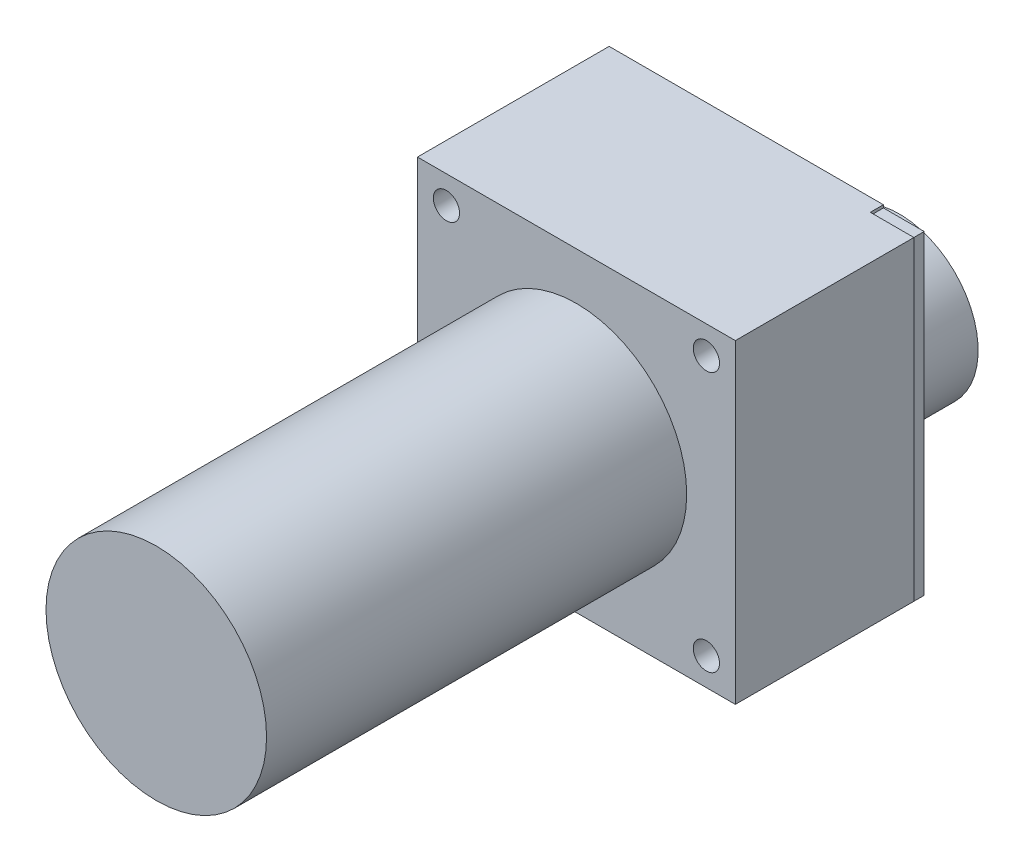
ISO-10303-21;
HEADER;
FILE_DESCRIPTION(('STEP AP214'),'2;1');
FILE_NAME('part.step','',(''),(''),'','','');
FILE_SCHEMA(('AUTOMOTIVE_DESIGN { 1 0 10303 214 1 1 1 1 }'));
ENDSEC;
DATA;
#1=APPLICATION_CONTEXT('core data for automotive mechanical design processes');
#2=APPLICATION_PROTOCOL_DEFINITION('international standard','automotive_design',2000,#1);
#3=PRODUCT_CONTEXT('',#1,'mechanical');
#4=PRODUCT('Part','Part','',(#3));
#5=PRODUCT_RELATED_PRODUCT_CATEGORY('part','',(#4));
#6=PRODUCT_DEFINITION_FORMATION('','',#4);
#7=PRODUCT_DEFINITION_CONTEXT('part definition',#1,'design');
#8=PRODUCT_DEFINITION('design','',#6,#7);
#9=PRODUCT_DEFINITION_SHAPE('','',#8);
#10=(LENGTH_UNIT() NAMED_UNIT(*) SI_UNIT(.MILLI.,.METRE.));
#11=(NAMED_UNIT(*) PLANE_ANGLE_UNIT() SI_UNIT($,.RADIAN.));
#12=(NAMED_UNIT(*) SI_UNIT($,.STERADIAN.) SOLID_ANGLE_UNIT());
#13=UNCERTAINTY_MEASURE_WITH_UNIT(LENGTH_MEASURE(1.E-05),#10,'distance_accuracy_value','');
#14=(GEOMETRIC_REPRESENTATION_CONTEXT(3) GLOBAL_UNCERTAINTY_ASSIGNED_CONTEXT((#13)) GLOBAL_UNIT_ASSIGNED_CONTEXT((#10,
#11,#12)) REPRESENTATION_CONTEXT('',''));
#15=CARTESIAN_POINT('',(0.,0.,0.));
#16=DIRECTION('',(0.,0.,1.));
#17=DIRECTION('',(1.,0.,0.));
#18=AXIS2_PLACEMENT_3D('',#15,#16,#17);
#19=CARTESIAN_POINT('',(0.,0.,2.5));
#20=DIRECTION('',(0.,0.,-1.));
#21=DIRECTION('',(-1.,0.,0.));
#22=AXIS2_PLACEMENT_3D('',#19,#20,#21);
#23=PLANE('',#22);
#24=DIRECTION('',(1.,0.,0.));
#25=VECTOR('',#24,1.);
#26=CARTESIAN_POINT('',(30.2680497080796,-30.,2.5));
#27=LINE('',#26,#25);
#28=CARTESIAN_POINT('',(22.5,-30.,2.5));
#29=VERTEX_POINT('',#28);
#30=CARTESIAN_POINT('',(29.7319502919204,-30.,2.5));
#31=VERTEX_POINT('',#30);
#32=EDGE_CURVE('E72',#29,#31,#27,.T.);
#33=ORIENTED_EDGE('',*,*,#32,.F.);
#34=DIRECTION('',(0.,-1.,0.));
#35=VECTOR('',#34,1.);
#36=CARTESIAN_POINT('',(22.4999999999999,0.,2.5));
#37=LINE('',#36,#35);
#38=CARTESIAN_POINT('',(22.5,-30.5313517930587,2.5));
#39=VERTEX_POINT('',#38);
#40=EDGE_CURVE('E184',#29,#39,#37,.T.);
#41=ORIENTED_EDGE('',*,*,#40,.T.);
#42=DIRECTION('',(1.,0.,0.));
#43=VECTOR('',#42,1.);
#44=CARTESIAN_POINT('',(22.5,-30.5313517930587,2.5));
#45=LINE('',#44,#43);
#46=CARTESIAN_POINT('',(29.7319502919204,-30.5313517930587,2.5));
#47=VERTEX_POINT('',#46);
#48=EDGE_CURVE('E155',#39,#47,#45,.T.);
#49=ORIENTED_EDGE('',*,*,#48,.T.);
#50=DIRECTION('',(0.,1.,0.));
#51=VECTOR('',#50,1.);
#52=CARTESIAN_POINT('',(29.7319502919204,-30.5313517930587,2.5));
#53=LINE('',#52,#51);
#54=EDGE_CURVE('E234',#47,#31,#53,.T.);
#55=ORIENTED_EDGE('',*,*,#54,.T.);
#56=EDGE_LOOP('',(#33,#41,#49,#55));
#57=FACE_BOUND('',#56,.T.);
#58=ADVANCED_FACE('F47',(#57),#23,.F.);
#59=CARTESIAN_POINT('',(22.5,-30.5313517930587,2.5));
#60=DIRECTION('',(0.,1.,0.));
#61=DIRECTION('',(0.,0.,1.));
#62=AXIS2_PLACEMENT_3D('',#59,#60,#61);
#63=PLANE('',#62);
#64=DIRECTION('',(1.,0.,0.));
#65=VECTOR('',#64,1.);
#66=CARTESIAN_POINT('',(22.5,-30.5313517930587,0.));
#67=LINE('',#66,#65);
#68=CARTESIAN_POINT('',(22.5,-30.5313517930587,0.));
#69=VERTEX_POINT('',#68);
#70=CARTESIAN_POINT('',(29.7319502919204,-30.5313517930587,0.));
#71=VERTEX_POINT('',#70);
#72=EDGE_CURVE('E232',#69,#71,#67,.T.);
#73=ORIENTED_EDGE('',*,*,#72,.T.);
#74=DIRECTION('',(0.,0.,-1.));
#75=VECTOR('',#74,1.);
#76=CARTESIAN_POINT('',(29.7319502919204,-30.5313517930587,2.5));
#77=LINE('',#76,#75);
#78=EDGE_CURVE('E169',#47,#71,#77,.T.);
#79=ORIENTED_EDGE('',*,*,#78,.F.);
#80=ORIENTED_EDGE('',*,*,#48,.F.);
#81=DIRECTION('',(0.,0.,-1.));
#82=VECTOR('',#81,1.);
#83=CARTESIAN_POINT('',(22.5,-30.5313517930587,2.5));
#84=LINE('',#83,#82);
#85=EDGE_CURVE('E56',#39,#69,#84,.T.);
#86=ORIENTED_EDGE('',*,*,#85,.T.);
#87=EDGE_LOOP('',(#73,#79,#80,#86));
#88=FACE_BOUND('',#87,.T.);
#89=ADVANCED_FACE('F49',(#88),#63,.F.);
#90=CARTESIAN_POINT('',(29.7319502919204,-30.5313517930587,2.5));
#91=DIRECTION('',(-1.,0.,0.));
#92=DIRECTION('',(0.,0.,1.));
#93=AXIS2_PLACEMENT_3D('',#90,#91,#92);
#94=PLANE('',#93);
#95=DIRECTION('',(0.,1.,0.));
#96=VECTOR('',#95,1.);
#97=CARTESIAN_POINT('',(29.7319502919204,-30.5313517930587,0.));
#98=LINE('',#97,#96);
#99=CARTESIAN_POINT('',(29.7319502919204,29.4686482069413,0.));
#100=VERTEX_POINT('',#99);
#101=EDGE_CURVE('E240',#71,#100,#98,.T.);
#102=ORIENTED_EDGE('',*,*,#101,.T.);
#103=DIRECTION('',(0.,0.,-1.));
#104=VECTOR('',#103,1.);
#105=CARTESIAN_POINT('',(29.7319502919204,29.4686482069413,2.5));
#106=LINE('',#105,#104);
#107=CARTESIAN_POINT('',(29.7319502919204,29.4686482069413,2.5));
#108=VERTEX_POINT('',#107);
#109=EDGE_CURVE('E167',#108,#100,#106,.T.);
#110=ORIENTED_EDGE('',*,*,#109,.F.);
#111=DIRECTION('',(0.,-1.,0.));
#112=VECTOR('',#111,1.);
#113=CARTESIAN_POINT('',(29.7319502919204,-30.5313517930587,2.5));
#114=LINE('',#113,#112);
#115=EDGE_CURVE('E230',#108,#31,#114,.T.);
#116=ORIENTED_EDGE('',*,*,#115,.T.);
#117=ORIENTED_EDGE('',*,*,#54,.F.);
#118=ORIENTED_EDGE('',*,*,#78,.T.);
#119=EDGE_LOOP('',(#102,#110,#116,#117,#118));
#120=FACE_BOUND('',#119,.T.);
#121=ADVANCED_FACE('F252',(#120),#94,.F.);
#122=CARTESIAN_POINT('',(21.9639005838407,29.4686482069413,2.5));
#123=DIRECTION('',(0.,1.,0.));
#124=DIRECTION('',(0.,0.,1.));
#125=AXIS2_PLACEMENT_3D('',#122,#123,#124);
#126=PLANE('',#125);
#127=DIRECTION('',(1.,0.,0.));
#128=VECTOR('',#127,1.);
#129=CARTESIAN_POINT('',(21.9639005838407,29.4686482069413,0.));
#130=LINE('',#129,#128);
#131=CARTESIAN_POINT('',(21.9639005838407,29.4686482069413,0.));
#132=VERTEX_POINT('',#131);
#133=EDGE_CURVE('E157',#132,#100,#130,.T.);
#134=ORIENTED_EDGE('',*,*,#133,.F.);
#135=DIRECTION('',(0.,0.,-1.));
#136=VECTOR('',#135,1.);
#137=CARTESIAN_POINT('',(21.9639005838407,29.4686482069413,2.5));
#138=LINE('',#137,#136);
#139=CARTESIAN_POINT('',(21.9639005838407,29.4686482069413,2.5));
#140=VERTEX_POINT('',#139);
#141=EDGE_CURVE('E163',#140,#132,#138,.T.);
#142=ORIENTED_EDGE('',*,*,#141,.F.);
#143=DIRECTION('',(1.,0.,0.));
#144=VECTOR('',#143,1.);
#145=CARTESIAN_POINT('',(21.9639005838407,29.4686482069413,2.5));
#146=LINE('',#145,#144);
#147=EDGE_CURVE('E164',#140,#108,#146,.T.);
#148=ORIENTED_EDGE('',*,*,#147,.T.);
#149=ORIENTED_EDGE('',*,*,#109,.T.);
#150=EDGE_LOOP('',(#134,#142,#148,#149));
#151=FACE_BOUND('',#150,.T.);
#152=ADVANCED_FACE('F248',(#151),#126,.T.);
#153=CARTESIAN_POINT('',(21.9639005838407,41.0818652881408,2.5));
#154=DIRECTION('',(1.,0.,0.));
#155=DIRECTION('',(0.,0.,-1.));
#156=AXIS2_PLACEMENT_3D('',#153,#154,#155);
#157=PLANE('',#156);
#158=DIRECTION('',(0.,0.,-1.));
#159=VECTOR('',#158,1.);
#160=CARTESIAN_POINT('',(21.9639005838407,30.,116.5));
#161=LINE('',#160,#159);
#162=CARTESIAN_POINT('',(21.9639005838407,30.,2.5));
#163=VERTEX_POINT('',#162);
#164=CARTESIAN_POINT('',(21.9639005838407,30.,0.));
#165=VERTEX_POINT('',#164);
#166=EDGE_CURVE('E64',#163,#165,#161,.T.);
#167=ORIENTED_EDGE('',*,*,#166,.F.);
#168=DIRECTION('',(0.,1.,0.));
#169=VECTOR('',#168,1.);
#170=CARTESIAN_POINT('',(21.9639005838407,41.0818652881408,2.5));
#171=LINE('',#170,#169);
#172=EDGE_CURVE('E227',#140,#163,#171,.T.);
#173=ORIENTED_EDGE('',*,*,#172,.F.);
#174=ORIENTED_EDGE('',*,*,#141,.T.);
#175=DIRECTION('',(0.,-1.,0.));
#176=VECTOR('',#175,1.);
#177=CARTESIAN_POINT('',(21.9639005838407,41.0818652881408,0.));
#178=LINE('',#177,#176);
#179=EDGE_CURVE('E153',#165,#132,#178,.T.);
#180=ORIENTED_EDGE('',*,*,#179,.F.);
#181=EDGE_LOOP('',(#167,#173,#174,#180));
#182=FACE_BOUND('',#181,.T.);
#183=ADVANCED_FACE('F319',(#182),#157,.T.);
#184=CARTESIAN_POINT('',(-30.2680497080796,-30.,2.5));
#185=DIRECTION('',(-1.,0.,0.));
#186=DIRECTION('',(0.,-1.,0.));
#187=AXIS2_PLACEMENT_3D('',#184,#185,#186);
#188=PLANE('',#187);
#189=DIRECTION('',(0.,0.,-1.));
#190=VECTOR('',#189,1.);
#191=CARTESIAN_POINT('',(-30.2680497080796,30.,36.5));
#192=LINE('',#191,#190);
#193=CARTESIAN_POINT('',(-30.2680497080796,30.,36.5));
#194=VERTEX_POINT('',#193);
#195=CARTESIAN_POINT('',(-30.2680497080796,30.,0.));
#196=VERTEX_POINT('',#195);
#197=EDGE_CURVE('E132',#194,#196,#192,.T.);
#198=ORIENTED_EDGE('',*,*,#197,.T.);
#199=DIRECTION('',(0.,1.,0.));
#200=VECTOR('',#199,1.);
#201=CARTESIAN_POINT('',(-30.2680497080796,-30.,0.));
#202=LINE('',#201,#200);
#203=CARTESIAN_POINT('',(-30.2680497080796,-30.,0.));
#204=VERTEX_POINT('',#203);
#205=EDGE_CURVE('E135',#204,#196,#202,.T.);
#206=ORIENTED_EDGE('',*,*,#205,.F.);
#207=DIRECTION('',(0.,0.,-1.));
#208=VECTOR('',#207,1.);
#209=CARTESIAN_POINT('',(-30.2680497080796,-30.,2.5));
#210=LINE('',#209,#208);
#211=CARTESIAN_POINT('',(-30.2680497080796,-30.,36.5));
#212=VERTEX_POINT('',#211);
#213=EDGE_CURVE('E161',#212,#204,#210,.T.);
#214=ORIENTED_EDGE('',*,*,#213,.F.);
#215=DIRECTION('',(0.,-1.,0.));
#216=VECTOR('',#215,1.);
#217=CARTESIAN_POINT('',(-30.2680497080796,-30.,36.5));
#218=LINE('',#217,#216);
#219=EDGE_CURVE('E137',#194,#212,#218,.T.);
#220=ORIENTED_EDGE('',*,*,#219,.F.);
#221=EDGE_LOOP('',(#198,#206,#214,#220));
#222=FACE_BOUND('',#221,.T.);
#223=ADVANCED_FACE('F133',(#222),#188,.T.);
#224=CARTESIAN_POINT('',(-30.2680497080796,-30.,2.5));
#225=DIRECTION('',(0.,1.,0.));
#226=DIRECTION('',(0.,0.,1.));
#227=AXIS2_PLACEMENT_3D('',#224,#225,#226);
#228=PLANE('',#227);
#229=DIRECTION('',(0.,0.,-1.));
#230=VECTOR('',#229,1.);
#231=CARTESIAN_POINT('',(22.5,-30.,116.5));
#232=LINE('',#231,#230);
#233=CARTESIAN_POINT('',(22.5,-30.,0.));
#234=VERTEX_POINT('',#233);
#235=EDGE_CURVE('E258',#29,#234,#232,.T.);
#236=ORIENTED_EDGE('',*,*,#235,.F.);
#237=ORIENTED_EDGE('',*,*,#32,.T.);
#238=CARTESIAN_POINT('',(30.2680497080796,-30.,2.5));
#239=VERTEX_POINT('',#238);
#240=EDGE_CURVE('E209',#31,#239,#27,.T.);
#241=ORIENTED_EDGE('',*,*,#240,.T.);
#242=DIRECTION('',(0.,0.,-1.));
#243=VECTOR('',#242,1.);
#244=CARTESIAN_POINT('',(30.2680497080796,-30.,36.5));
#245=LINE('',#244,#243);
#246=CARTESIAN_POINT('',(30.2680497080796,-30.,36.5));
#247=VERTEX_POINT('',#246);
#248=EDGE_CURVE('E224',#247,#239,#245,.T.);
#249=ORIENTED_EDGE('',*,*,#248,.F.);
#250=DIRECTION('',(1.,0.,0.));
#251=VECTOR('',#250,1.);
#252=CARTESIAN_POINT('',(30.2680497080796,-30.,36.5));
#253=LINE('',#252,#251);
#254=EDGE_CURVE('E212',#212,#247,#253,.T.);
#255=ORIENTED_EDGE('',*,*,#254,.F.);
#256=ORIENTED_EDGE('',*,*,#213,.T.);
#257=DIRECTION('',(1.,0.,0.));
#258=VECTOR('',#257,1.);
#259=CARTESIAN_POINT('',(-30.2680497080796,-30.,0.));
#260=LINE('',#259,#258);
#261=EDGE_CURVE('E152',#204,#234,#260,.T.);
#262=ORIENTED_EDGE('',*,*,#261,.T.);
#263=EDGE_LOOP('',(#236,#237,#241,#249,#255,#256,#262));
#264=FACE_BOUND('',#263,.T.);
#265=ADVANCED_FACE('F277',(#264),#228,.F.);
#266=CARTESIAN_POINT('',(0.,0.,0.));
#267=DIRECTION('',(0.,0.,-1.));
#268=DIRECTION('',(-1.,0.,0.));
#269=AXIS2_PLACEMENT_3D('',#266,#267,#268);
#270=PLANE('',#269);
#271=DIRECTION('',(-1.,0.,0.));
#272=VECTOR('',#271,1.);
#273=CARTESIAN_POINT('',(-30.2680497080796,30.,0.));
#274=LINE('',#273,#272);
#275=EDGE_CURVE('E142',#165,#196,#274,.T.);
#276=ORIENTED_EDGE('',*,*,#275,.F.);
#277=ORIENTED_EDGE('',*,*,#179,.T.);
#278=ORIENTED_EDGE('',*,*,#133,.T.);
#279=ORIENTED_EDGE('',*,*,#101,.F.);
#280=ORIENTED_EDGE('',*,*,#72,.F.);
#281=DIRECTION('',(0.,-1.,0.));
#282=VECTOR('',#281,1.);
#283=CARTESIAN_POINT('',(22.5,-38.9181347118592,0.));
#284=LINE('',#283,#282);
#285=EDGE_CURVE('E146',#234,#69,#284,.T.);
#286=ORIENTED_EDGE('',*,*,#285,.F.);
#287=ORIENTED_EDGE('',*,*,#261,.F.);
#288=ORIENTED_EDGE('',*,*,#205,.T.);
#289=EDGE_LOOP('',(#276,#277,#278,#279,#280,#286,#287,#288));
#290=FACE_BOUND('',#289,.T.);
#291=CARTESIAN_POINT('',(24.75,-24.75,0.));
#292=DIRECTION('',(0.,0.,-1.));
#293=DIRECTION('',(1.,0.,0.));
#294=AXIS2_PLACEMENT_3D('',#291,#292,#293);
#295=CIRCLE('',#294,2.5);
#296=CARTESIAN_POINT('',(27.25,-24.75,0.));
#297=VERTEX_POINT('',#296);
#298=EDGE_CURVE('E265',#297,#297,#295,.T.);
#299=ORIENTED_EDGE('',*,*,#298,.F.);
#300=EDGE_LOOP('',(#299));
#301=FACE_BOUND('',#300,.T.);
#302=CARTESIAN_POINT('',(24.75,24.75,0.));
#303=DIRECTION('',(0.,0.,-1.));
#304=DIRECTION('',(-1.,0.,0.));
#305=AXIS2_PLACEMENT_3D('',#302,#303,#304);
#306=CIRCLE('',#305,2.5);
#307=CARTESIAN_POINT('',(22.25,24.75,0.));
#308=VERTEX_POINT('',#307);
#309=EDGE_CURVE('E197',#308,#308,#306,.T.);
#310=ORIENTED_EDGE('',*,*,#309,.F.);
#311=EDGE_LOOP('',(#310));
#312=FACE_BOUND('',#311,.T.);
#313=CARTESIAN_POINT('',(-24.75,24.75,0.));
#314=DIRECTION('',(0.,0.,-1.));
#315=DIRECTION('',(1.,0.,0.));
#316=AXIS2_PLACEMENT_3D('',#313,#314,#315);
#317=CIRCLE('',#316,2.5);
#318=CARTESIAN_POINT('',(-22.25,24.75,0.));
#319=VERTEX_POINT('',#318);
#320=EDGE_CURVE('E264',#319,#319,#317,.T.);
#321=ORIENTED_EDGE('',*,*,#320,.F.);
#322=EDGE_LOOP('',(#321));
#323=FACE_BOUND('',#322,.T.);
#324=CARTESIAN_POINT('',(-24.75,-24.75,0.));
#325=DIRECTION('',(0.,0.,-1.));
#326=DIRECTION('',(-1.,0.,0.));
#327=AXIS2_PLACEMENT_3D('',#324,#325,#326);
#328=CIRCLE('',#327,2.5);
#329=CARTESIAN_POINT('',(-27.25,-24.75,0.));
#330=VERTEX_POINT('',#329);
#331=EDGE_CURVE('E261',#330,#330,#328,.T.);
#332=ORIENTED_EDGE('',*,*,#331,.F.);
#333=EDGE_LOOP('',(#332));
#334=FACE_BOUND('',#333,.T.);
#335=CARTESIAN_POINT('',(0.,-9.99999999999999,0.));
#336=DIRECTION('',(0.,0.,-1.));
#337=DIRECTION('',(-1.,0.,0.));
#338=AXIS2_PLACEMENT_3D('',#335,#336,#337);
#339=CIRCLE('',#338,4.);
#340=CARTESIAN_POINT('',(-4.,-9.99999999999999,0.));
#341=VERTEX_POINT('',#340);
#342=EDGE_CURVE('E200',#341,#341,#339,.T.);
#343=ORIENTED_EDGE('',*,*,#342,.F.);
#344=EDGE_LOOP('',(#343));
#345=FACE_BOUND('',#344,.T.);
#346=ADVANCED_FACE('F149',(#290,#301,#312,#323,#334,#345),#270,.T.);
#347=CARTESIAN_POINT('',(0.,0.,2.5));
#348=DIRECTION('',(0.,0.,-1.));
#349=DIRECTION('',(-1.,0.,0.));
#350=AXIS2_PLACEMENT_3D('',#347,#348,#349);
#351=PLANE('',#350);
#352=ORIENTED_EDGE('',*,*,#115,.F.);
#353=ORIENTED_EDGE('',*,*,#147,.F.);
#354=ORIENTED_EDGE('',*,*,#172,.T.);
#355=DIRECTION('',(-1.,0.,0.));
#356=VECTOR('',#355,1.);
#357=CARTESIAN_POINT('',(-30.2680497080796,30.,2.5));
#358=LINE('',#357,#356);
#359=CARTESIAN_POINT('',(30.2680497080796,30.,2.5));
#360=VERTEX_POINT('',#359);
#361=EDGE_CURVE('E213',#360,#163,#358,.T.);
#362=ORIENTED_EDGE('',*,*,#361,.F.);
#363=DIRECTION('',(0.,1.,0.));
#364=VECTOR('',#363,1.);
#365=CARTESIAN_POINT('',(30.2680497080796,30.,2.5));
#366=LINE('',#365,#364);
#367=EDGE_CURVE('E219',#239,#360,#366,.T.);
#368=ORIENTED_EDGE('',*,*,#367,.F.);
#369=ORIENTED_EDGE('',*,*,#240,.F.);
#370=EDGE_LOOP('',(#352,#353,#354,#362,#368,#369));
#371=FACE_BOUND('',#370,.T.);
#372=ADVANCED_FACE('F276',(#371),#351,.T.);
#373=CARTESIAN_POINT('',(30.2680497080796,30.,36.5));
#374=DIRECTION('',(-1.,0.,0.));
#375=DIRECTION('',(0.,0.,1.));
#376=AXIS2_PLACEMENT_3D('',#373,#374,#375);
#377=PLANE('',#376);
#378=ORIENTED_EDGE('',*,*,#367,.T.);
#379=DIRECTION('',(0.,0.,-1.));
#380=VECTOR('',#379,1.);
#381=CARTESIAN_POINT('',(30.2680497080796,30.,36.5));
#382=LINE('',#381,#380);
#383=CARTESIAN_POINT('',(30.2680497080796,30.,36.5));
#384=VERTEX_POINT('',#383);
#385=EDGE_CURVE('E139',#384,#360,#382,.T.);
#386=ORIENTED_EDGE('',*,*,#385,.F.);
#387=DIRECTION('',(0.,1.,0.));
#388=VECTOR('',#387,1.);
#389=CARTESIAN_POINT('',(30.2680497080796,30.,36.5));
#390=LINE('',#389,#388);
#391=EDGE_CURVE('E215',#247,#384,#390,.T.);
#392=ORIENTED_EDGE('',*,*,#391,.F.);
#393=ORIENTED_EDGE('',*,*,#248,.T.);
#394=EDGE_LOOP('',(#378,#386,#392,#393));
#395=FACE_BOUND('',#394,.T.);
#396=ADVANCED_FACE('F312',(#395),#377,.F.);
#397=CARTESIAN_POINT('',(-30.2680497080796,30.,36.5));
#398=DIRECTION('',(0.,-1.,0.));
#399=DIRECTION('',(0.,0.,-1.));
#400=AXIS2_PLACEMENT_3D('',#397,#398,#399);
#401=PLANE('',#400);
#402=ORIENTED_EDGE('',*,*,#361,.T.);
#403=ORIENTED_EDGE('',*,*,#166,.T.);
#404=ORIENTED_EDGE('',*,*,#275,.T.);
#405=ORIENTED_EDGE('',*,*,#197,.F.);
#406=DIRECTION('',(-1.,0.,0.));
#407=VECTOR('',#406,1.);
#408=CARTESIAN_POINT('',(-30.2680497080796,30.,36.5));
#409=LINE('',#408,#407);
#410=EDGE_CURVE('E140',#384,#194,#409,.T.);
#411=ORIENTED_EDGE('',*,*,#410,.F.);
#412=ORIENTED_EDGE('',*,*,#385,.T.);
#413=EDGE_LOOP('',(#402,#403,#404,#405,#411,#412));
#414=FACE_BOUND('',#413,.T.);
#415=ADVANCED_FACE('F143',(#414),#401,.F.);
#416=CARTESIAN_POINT('',(0.,0.,36.5));
#417=DIRECTION('',(0.,0.,-1.));
#418=DIRECTION('',(-1.,0.,0.));
#419=AXIS2_PLACEMENT_3D('',#416,#417,#418);
#420=PLANE('',#419);
#421=CARTESIAN_POINT('',(24.75,-24.75,36.5));
#422=DIRECTION('',(0.,0.,-1.));
#423=DIRECTION('',(-1.,0.,0.));
#424=AXIS2_PLACEMENT_3D('',#421,#422,#423);
#425=CIRCLE('',#424,2.5);
#426=CARTESIAN_POINT('',(22.25,-24.75,36.5));
#427=VERTEX_POINT('',#426);
#428=EDGE_CURVE('E51',#427,#427,#425,.T.);
#429=ORIENTED_EDGE('',*,*,#428,.T.);
#430=EDGE_LOOP('',(#429));
#431=FACE_BOUND('',#430,.T.);
#432=CARTESIAN_POINT('',(24.75,24.75,36.5));
#433=DIRECTION('',(0.,0.,-1.));
#434=DIRECTION('',(-1.,0.,0.));
#435=AXIS2_PLACEMENT_3D('',#432,#433,#434);
#436=CIRCLE('',#435,2.5);
#437=CARTESIAN_POINT('',(22.25,24.75,36.5));
#438=VERTEX_POINT('',#437);
#439=EDGE_CURVE('E179',#438,#438,#436,.T.);
#440=ORIENTED_EDGE('',*,*,#439,.T.);
#441=EDGE_LOOP('',(#440));
#442=FACE_BOUND('',#441,.T.);
#443=CARTESIAN_POINT('',(-24.75,24.75,36.5));
#444=DIRECTION('',(0.,0.,-1.));
#445=DIRECTION('',(-1.,0.,0.));
#446=AXIS2_PLACEMENT_3D('',#443,#444,#445);
#447=CIRCLE('',#446,2.5);
#448=CARTESIAN_POINT('',(-27.25,24.75,36.5));
#449=VERTEX_POINT('',#448);
#450=EDGE_CURVE('E177',#449,#449,#447,.T.);
#451=ORIENTED_EDGE('',*,*,#450,.T.);
#452=EDGE_LOOP('',(#451));
#453=FACE_BOUND('',#452,.T.);
#454=CARTESIAN_POINT('',(-24.75,-24.75,36.5));
#455=DIRECTION('',(0.,0.,-1.));
#456=DIRECTION('',(-1.,0.,0.));
#457=AXIS2_PLACEMENT_3D('',#454,#455,#456);
#458=CIRCLE('',#457,2.5);
#459=CARTESIAN_POINT('',(-27.25,-24.75,36.5));
#460=VERTEX_POINT('',#459);
#461=EDGE_CURVE('E174',#460,#460,#458,.T.);
#462=ORIENTED_EDGE('',*,*,#461,.T.);
#463=EDGE_LOOP('',(#462));
#464=FACE_BOUND('',#463,.T.);
#465=CARTESIAN_POINT('',(0.,0.,36.5));
#466=DIRECTION('',(0.,0.,1.));
#467=DIRECTION('',(1.,0.,0.));
#468=AXIS2_PLACEMENT_3D('',#465,#466,#467);
#469=CIRCLE('',#468,21.);
#470=CARTESIAN_POINT('',(21.,0.,36.5));
#471=VERTEX_POINT('',#470);
#472=EDGE_CURVE('E11',#471,#471,#469,.T.);
#473=ORIENTED_EDGE('',*,*,#472,.F.);
#474=EDGE_LOOP('',(#473));
#475=FACE_BOUND('',#474,.T.);
#476=ORIENTED_EDGE('',*,*,#219,.T.);
#477=ORIENTED_EDGE('',*,*,#254,.T.);
#478=ORIENTED_EDGE('',*,*,#391,.T.);
#479=ORIENTED_EDGE('',*,*,#410,.T.);
#480=EDGE_LOOP('',(#476,#477,#478,#479));
#481=FACE_BOUND('',#480,.T.);
#482=ADVANCED_FACE('F377',(#431,#442,#453,#464,#475,#481),#420,.F.);
#483=CARTESIAN_POINT('',(0.,0.,116.5));
#484=DIRECTION('',(0.,0.,-1.));
#485=DIRECTION('',(-1.,0.,0.));
#486=AXIS2_PLACEMENT_3D('',#483,#484,#485);
#487=CYLINDRICAL_SURFACE('',#486,21.);
#488=CARTESIAN_POINT('',(0.,0.,116.5));
#489=DIRECTION('',(0.,0.,1.));
#490=DIRECTION('',(1.,0.,0.));
#491=AXIS2_PLACEMENT_3D('',#488,#489,#490);
#492=CIRCLE('',#491,21.);
#493=CARTESIAN_POINT('',(21.,0.,116.5));
#494=VERTEX_POINT('',#493);
#495=EDGE_CURVE('E205',#494,#494,#492,.T.);
#496=ORIENTED_EDGE('',*,*,#495,.F.);
#497=EDGE_LOOP('',(#496));
#498=FACE_BOUND('',#497,.T.);
#499=ORIENTED_EDGE('',*,*,#472,.T.);
#500=EDGE_LOOP('',(#499));
#501=FACE_BOUND('',#500,.T.);
#502=ADVANCED_FACE('F301',(#498,#501),#487,.T.);
#503=CARTESIAN_POINT('',(0.,0.,116.5));
#504=DIRECTION('',(0.,0.,1.));
#505=DIRECTION('',(1.,0.,0.));
#506=AXIS2_PLACEMENT_3D('',#503,#504,#505);
#507=PLANE('',#506);
#508=ORIENTED_EDGE('',*,*,#495,.T.);
#509=EDGE_LOOP('',(#508));
#510=FACE_BOUND('',#509,.T.);
#511=ADVANCED_FACE('F291',(#510),#507,.T.);
#512=CARTESIAN_POINT('',(0.,-9.99999999999999,-3.));
#513=DIRECTION('',(0.,0.,1.));
#514=DIRECTION('',(1.,0.,0.));
#515=AXIS2_PLACEMENT_3D('',#512,#513,#514);
#516=CYLINDRICAL_SURFACE('',#515,4.);
#517=CARTESIAN_POINT('',(0.,-9.99999999999999,-3.));
#518=DIRECTION('',(0.,0.,-1.));
#519=DIRECTION('',(-1.,0.,0.));
#520=AXIS2_PLACEMENT_3D('',#517,#518,#519);
#521=CIRCLE('',#520,4.);
#522=CARTESIAN_POINT('',(-4.,-9.99999999999999,-3.));
#523=VERTEX_POINT('',#522);
#524=EDGE_CURVE('E202',#523,#523,#521,.T.);
#525=ORIENTED_EDGE('',*,*,#524,.F.);
#526=EDGE_LOOP('',(#525));
#527=FACE_BOUND('',#526,.T.);
#528=ORIENTED_EDGE('',*,*,#342,.T.);
#529=EDGE_LOOP('',(#528));
#530=FACE_BOUND('',#529,.T.);
#531=ADVANCED_FACE('F288',(#527,#530),#516,.T.);
#532=CARTESIAN_POINT('',(0.,-9.99999999999999,-25.));
#533=DIRECTION('',(0.,0.,1.));
#534=DIRECTION('',(1.,0.,0.));
#535=AXIS2_PLACEMENT_3D('',#532,#533,#534);
#536=CYLINDRICAL_SURFACE('',#535,15.);
#537=CARTESIAN_POINT('',(0.,-9.99999999999999,-25.));
#538=DIRECTION('',(0.,0.,-1.));
#539=DIRECTION('',(-1.,0.,0.));
#540=AXIS2_PLACEMENT_3D('',#537,#538,#539);
#541=CIRCLE('',#540,15.);
#542=CARTESIAN_POINT('',(-15.,-9.99999999999999,-25.));
#543=VERTEX_POINT('',#542);
#544=EDGE_CURVE('E193',#543,#543,#541,.T.);
#545=ORIENTED_EDGE('',*,*,#544,.F.);
#546=EDGE_LOOP('',(#545));
#547=FACE_BOUND('',#546,.T.);
#548=CARTESIAN_POINT('',(0.,-9.99999999999999,-3.));
#549=DIRECTION('',(0.,0.,-1.));
#550=DIRECTION('',(-1.,0.,0.));
#551=AXIS2_PLACEMENT_3D('',#548,#549,#550);
#552=CIRCLE('',#551,15.);
#553=CARTESIAN_POINT('',(-15.,-9.99999999999999,-3.));
#554=VERTEX_POINT('',#553);
#555=EDGE_CURVE('E188',#554,#554,#552,.T.);
#556=ORIENTED_EDGE('',*,*,#555,.T.);
#557=EDGE_LOOP('',(#556));
#558=FACE_BOUND('',#557,.T.);
#559=ADVANCED_FACE('F290',(#547,#558),#536,.T.);
#560=CARTESIAN_POINT('',(0.,-9.99999999999999,-25.));
#561=DIRECTION('',(0.,0.,-1.));
#562=DIRECTION('',(-1.,0.,0.));
#563=AXIS2_PLACEMENT_3D('',#560,#561,#562);
#564=PLANE('',#563);
#565=ORIENTED_EDGE('',*,*,#544,.T.);
#566=EDGE_LOOP('',(#565));
#567=FACE_BOUND('',#566,.T.);
#568=ADVANCED_FACE('F298',(#567),#564,.T.);
#569=CARTESIAN_POINT('',(0.,-9.99999999999999,-3.));
#570=DIRECTION('',(0.,0.,-1.));
#571=DIRECTION('',(-1.,0.,0.));
#572=AXIS2_PLACEMENT_3D('',#569,#570,#571);
#573=PLANE('',#572);
#574=ORIENTED_EDGE('',*,*,#524,.T.);
#575=EDGE_LOOP('',(#574));
#576=FACE_BOUND('',#575,.T.);
#577=ORIENTED_EDGE('',*,*,#555,.F.);
#578=EDGE_LOOP('',(#577));
#579=FACE_BOUND('',#578,.T.);
#580=ADVANCED_FACE('F367',(#576,#579),#573,.F.);
#581=CARTESIAN_POINT('',(-24.75,-24.75,116.5));
#582=DIRECTION('',(0.,0.,-1.));
#583=DIRECTION('',(-1.,0.,0.));
#584=AXIS2_PLACEMENT_3D('',#581,#582,#583);
#585=CYLINDRICAL_SURFACE('',#584,2.5);
#586=ORIENTED_EDGE('',*,*,#331,.T.);
#587=EDGE_LOOP('',(#586));
#588=FACE_BOUND('',#587,.T.);
#589=ORIENTED_EDGE('',*,*,#461,.F.);
#590=EDGE_LOOP('',(#589));
#591=FACE_BOUND('',#590,.T.);
#592=ADVANCED_FACE('F385',(#588,#591),#585,.F.);
#593=CARTESIAN_POINT('',(-24.75,24.75,116.5));
#594=DIRECTION('',(0.,0.,-1.));
#595=DIRECTION('',(-1.,0.,0.));
#596=AXIS2_PLACEMENT_3D('',#593,#594,#595);
#597=CYLINDRICAL_SURFACE('',#596,2.5);
#598=ORIENTED_EDGE('',*,*,#320,.T.);
#599=EDGE_LOOP('',(#598));
#600=FACE_BOUND('',#599,.T.);
#601=ORIENTED_EDGE('',*,*,#450,.F.);
#602=EDGE_LOOP('',(#601));
#603=FACE_BOUND('',#602,.T.);
#604=ADVANCED_FACE('F391',(#600,#603),#597,.F.);
#605=CARTESIAN_POINT('',(24.75,24.75,116.5));
#606=DIRECTION('',(0.,0.,-1.));
#607=DIRECTION('',(-1.,0.,0.));
#608=AXIS2_PLACEMENT_3D('',#605,#606,#607);
#609=CYLINDRICAL_SURFACE('',#608,2.5);
#610=ORIENTED_EDGE('',*,*,#309,.T.);
#611=EDGE_LOOP('',(#610));
#612=FACE_BOUND('',#611,.T.);
#613=ORIENTED_EDGE('',*,*,#439,.F.);
#614=EDGE_LOOP('',(#613));
#615=FACE_BOUND('',#614,.T.);
#616=ADVANCED_FACE('F401',(#612,#615),#609,.F.);
#617=CARTESIAN_POINT('',(24.75,-24.75,116.5));
#618=DIRECTION('',(0.,0.,-1.));
#619=DIRECTION('',(-1.,0.,0.));
#620=AXIS2_PLACEMENT_3D('',#617,#618,#619);
#621=CYLINDRICAL_SURFACE('',#620,2.5);
#622=ORIENTED_EDGE('',*,*,#298,.T.);
#623=EDGE_LOOP('',(#622));
#624=FACE_BOUND('',#623,.T.);
#625=ORIENTED_EDGE('',*,*,#428,.F.);
#626=EDGE_LOOP('',(#625));
#627=FACE_BOUND('',#626,.T.);
#628=ADVANCED_FACE('F272',(#624,#627),#621,.F.);
#629=CARTESIAN_POINT('',(22.5,-38.9181347118592,116.5));
#630=DIRECTION('',(1.,0.,0.));
#631=DIRECTION('',(0.,1.,0.));
#632=AXIS2_PLACEMENT_3D('',#629,#630,#631);
#633=PLANE('',#632);
#634=ORIENTED_EDGE('',*,*,#40,.F.);
#635=ORIENTED_EDGE('',*,*,#235,.T.);
#636=ORIENTED_EDGE('',*,*,#285,.T.);
#637=ORIENTED_EDGE('',*,*,#85,.F.);
#638=EDGE_LOOP('',(#634,#635,#636,#637));
#639=FACE_BOUND('',#638,.T.);
#640=ADVANCED_FACE('F420',(#639),#633,.F.);
#641=CLOSED_SHELL('',(#58,#89,#121,#152,#183,#223,#265,#346,#372,#396,#415,#482,#502,#511,#531,
#559,#568,#580,#592,#604,#616,#628,#640));
#642=MANIFOLD_SOLID_BREP('B2',#641);
#643=ADVANCED_BREP_SHAPE_REPRESENTATION('',(#18,#642),#14);
#644=SHAPE_DEFINITION_REPRESENTATION(#9,#643);
ENDSEC;
END-ISO-10303-21;
